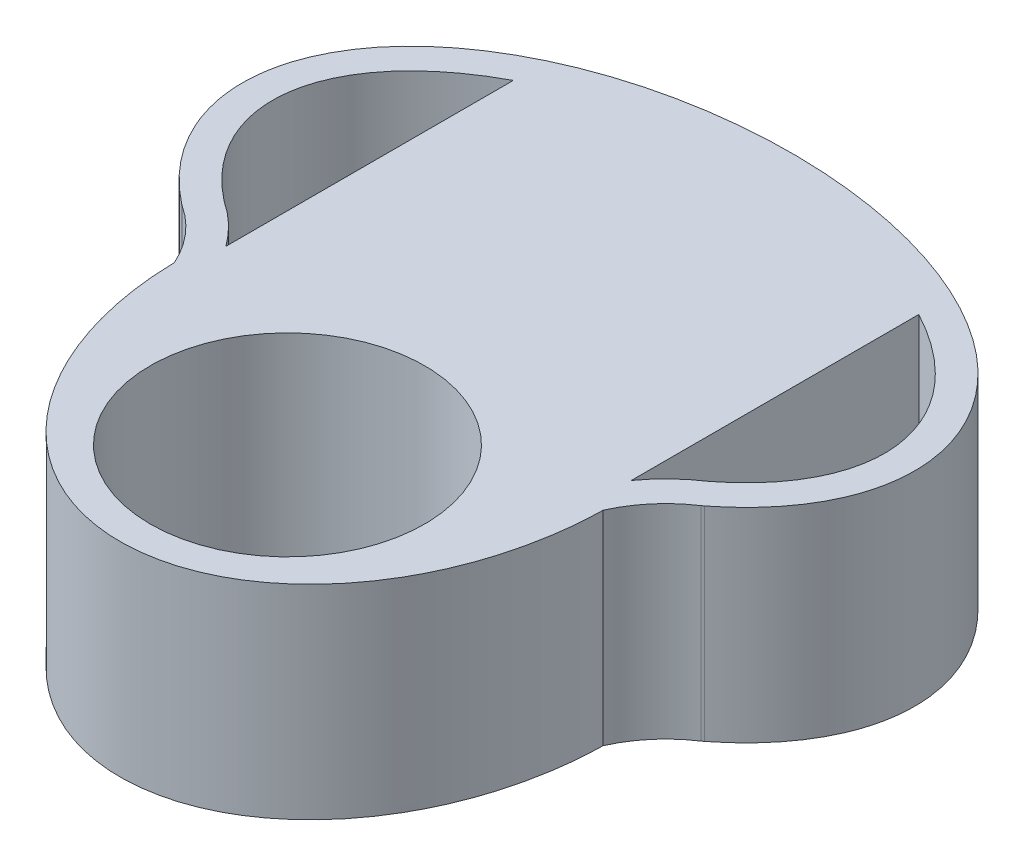
ISO-10303-21;
HEADER;
FILE_DESCRIPTION(('STEP AP214'),'2;1');
FILE_NAME('part.step','',(''),(''),'','','');
FILE_SCHEMA(('AUTOMOTIVE_DESIGN { 1 0 10303 214 1 1 1 1 }'));
ENDSEC;
DATA;
#1=APPLICATION_CONTEXT('core data for automotive mechanical design processes');
#2=APPLICATION_PROTOCOL_DEFINITION('international standard','automotive_design',2000,#1);
#3=PRODUCT_CONTEXT('',#1,'mechanical');
#4=PRODUCT('Part','Part','',(#3));
#5=PRODUCT_RELATED_PRODUCT_CATEGORY('part','',(#4));
#6=PRODUCT_DEFINITION_FORMATION('','',#4);
#7=PRODUCT_DEFINITION_CONTEXT('part definition',#1,'design');
#8=PRODUCT_DEFINITION('design','',#6,#7);
#9=PRODUCT_DEFINITION_SHAPE('','',#8);
#10=(LENGTH_UNIT() NAMED_UNIT(*) SI_UNIT(.MILLI.,.METRE.));
#11=(NAMED_UNIT(*) PLANE_ANGLE_UNIT() SI_UNIT($,.RADIAN.));
#12=(NAMED_UNIT(*) SI_UNIT($,.STERADIAN.) SOLID_ANGLE_UNIT());
#13=UNCERTAINTY_MEASURE_WITH_UNIT(LENGTH_MEASURE(1.E-05),#10,'distance_accuracy_value','');
#14=(GEOMETRIC_REPRESENTATION_CONTEXT(3) GLOBAL_UNCERTAINTY_ASSIGNED_CONTEXT((#13)) GLOBAL_UNIT_ASSIGNED_CONTEXT((#10,
#11,#12)) REPRESENTATION_CONTEXT('',''));
#15=CARTESIAN_POINT('',(0.,0.,0.));
#16=DIRECTION('',(0.,0.,1.));
#17=DIRECTION('',(1.,0.,0.));
#18=AXIS2_PLACEMENT_3D('',#15,#16,#17);
#19=CARTESIAN_POINT('',(-81.4182714062224,63.5,42.1452711751867));
#20=CARTESIAN_POINT('',(-82.1708929781573,63.5,41.5556056887247));
#21=CARTESIAN_POINT('',(-83.6619475125654,63.5,40.344682659538));
#22=CARTESIAN_POINT('',(-86.5049171261992,63.5,37.858902663532));
#23=CARTESIAN_POINT('',(-89.8261064509955,63.5,34.6056144611416));
#24=CARTESIAN_POINT('',(-93.4024484768764,63.5,30.4841299490515));
#25=CARTESIAN_POINT('',(-97.5926099560615,63.5,24.7087254973296));
#26=CARTESIAN_POINT('',(-101.670899734114,63.5,16.9947837439685));
#27=CARTESIAN_POINT('',(-104.458923137578,63.5,7.12114955794227));
#28=CARTESIAN_POINT('',(-104.93539808692,63.5,-3.04481984295246));
#29=CARTESIAN_POINT('',(-102.433523024151,63.5,-16.4361873171428));
#30=CARTESIAN_POINT('',(-93.8030884577416,63.5,-31.8529588916091));
#31=CARTESIAN_POINT('',(-76.6112472127849,63.5,-46.8727046124652));
#32=CARTESIAN_POINT('',(-54.1788674721127,63.5,-58.0537064339531));
#33=CARTESIAN_POINT('',(-28.0503761909839,63.5,-64.9811066700789));
#34=CARTESIAN_POINT('',(0.,63.5,-67.3314466649606));
#35=CARTESIAN_POINT('',(28.0503761909839,63.5,-64.9811066700788));
#36=CARTESIAN_POINT('',(54.1788674721128,63.5,-58.0537064339531));
#37=CARTESIAN_POINT('',(76.6112472127849,63.5,-46.8727046124652));
#38=CARTESIAN_POINT('',(93.8030884577416,63.5,-31.8529588916091));
#39=CARTESIAN_POINT('',(102.433523024151,63.5,-16.4361873171428));
#40=CARTESIAN_POINT('',(104.93539808692,63.5,-3.04481984295245));
#41=CARTESIAN_POINT('',(104.458923137578,63.5,7.12114955794228));
#42=CARTESIAN_POINT('',(101.670899734114,63.5,16.9947837439686));
#43=CARTESIAN_POINT('',(97.5926099560615,63.5,24.7087254973296));
#44=CARTESIAN_POINT('',(93.4024484768764,63.5,30.4841299490515));
#45=CARTESIAN_POINT('',(89.8261064509955,63.5,34.6056144611416));
#46=CARTESIAN_POINT('',(86.5049171261991,63.5,37.8589026635321));
#47=CARTESIAN_POINT('',(83.6619475125654,63.5,40.344682659538));
#48=CARTESIAN_POINT('',(82.1708929781573,63.5,41.5556056887247));
#49=CARTESIAN_POINT('',(81.4182714062224,63.5,42.1452711751867));
#50=B_SPLINE_CURVE_WITH_KNOTS('',3,(#19,#20,#21,#22,#23,#24,#25,#26,#27,#28,#29,#30,#31,#32,#33,
#34,#35,#36,#37,#38,#39,#40,#41,#42,#43,#44,#45,#46,#47,#48,#49),.UNSPECIFIED.,.F.,.F.,(4,1,1,1,
1,1,1,1,1,1,1,1,1,1,1,1,1,1,1,1,1,1,1,1,1,1,1,1,4),(-0.653544263959844,-0.618788942229301,
-0.584033620498758,-0.514522977037672,-0.445012333576587,-0.375501690115501,-0.23648040319333,
-0.0974591162711587,0.0415621706510123,0.180583457573184,0.458626031417526,0.736668605261869,
1.01471117910621,1.29275375295055,1.5707963267949,1.84883890063924,2.12688147448358,
2.40492404832792,2.68296662217227,2.96100919601661,3.10003048293878,3.23905176986095,
3.37807305678312,3.51709434370529,3.58660498716638,3.65611563062747,3.72562627408855,
3.76038159581909,3.79513691754964),.UNSPECIFIED.);
#51=DIRECTION('',(0.,-1.,0.));
#52=VECTOR('',#51,1.);
#53=SURFACE_OF_LINEAR_EXTRUSION('',#50,#52);
#54=CARTESIAN_POINT('',(-81.4182714062224,0.,42.1452711751867));
#55=CARTESIAN_POINT('',(-82.1708929781573,0.,41.5556056887247));
#56=CARTESIAN_POINT('',(-83.6619475125654,0.,40.344682659538));
#57=CARTESIAN_POINT('',(-86.5049171261992,0.,37.858902663532));
#58=CARTESIAN_POINT('',(-89.8261064509955,0.,34.6056144611416));
#59=CARTESIAN_POINT('',(-93.4024484768764,0.,30.4841299490515));
#60=CARTESIAN_POINT('',(-97.5926099560615,0.,24.7087254973296));
#61=CARTESIAN_POINT('',(-101.670899734114,0.,16.9947837439685));
#62=CARTESIAN_POINT('',(-104.458923137578,0.,7.12114955794227));
#63=CARTESIAN_POINT('',(-104.93539808692,0.,-3.04481984295246));
#64=CARTESIAN_POINT('',(-102.433523024151,0.,-16.4361873171428));
#65=CARTESIAN_POINT('',(-93.8030884577416,0.,-31.8529588916091));
#66=CARTESIAN_POINT('',(-76.6112472127849,0.,-46.8727046124652));
#67=CARTESIAN_POINT('',(-54.1788674721127,0.,-58.0537064339531));
#68=CARTESIAN_POINT('',(-28.0503761909839,0.,-64.9811066700789));
#69=CARTESIAN_POINT('',(0.,0.,-67.3314466649606));
#70=CARTESIAN_POINT('',(28.0503761909839,0.,-64.9811066700788));
#71=CARTESIAN_POINT('',(54.1788674721128,0.,-58.0537064339531));
#72=CARTESIAN_POINT('',(76.6112472127849,0.,-46.8727046124652));
#73=CARTESIAN_POINT('',(93.8030884577416,0.,-31.8529588916091));
#74=CARTESIAN_POINT('',(102.433523024151,0.,-16.4361873171428));
#75=CARTESIAN_POINT('',(104.93539808692,0.,-3.04481984295245));
#76=CARTESIAN_POINT('',(104.458923137578,0.,7.12114955794228));
#77=CARTESIAN_POINT('',(101.670899734114,0.,16.9947837439686));
#78=CARTESIAN_POINT('',(97.5926099560615,0.,24.7087254973296));
#79=CARTESIAN_POINT('',(93.4024484768764,0.,30.4841299490515));
#80=CARTESIAN_POINT('',(89.8261064509955,0.,34.6056144611416));
#81=CARTESIAN_POINT('',(86.5049171261991,0.,37.8589026635321));
#82=CARTESIAN_POINT('',(83.6619475125654,0.,40.344682659538));
#83=CARTESIAN_POINT('',(82.1708929781573,0.,41.5556056887247));
#84=CARTESIAN_POINT('',(81.4182714062224,0.,42.1452711751867));
#85=B_SPLINE_CURVE_WITH_KNOTS('',3,(#54,#55,#56,#57,#58,#59,#60,#61,#62,#63,#64,#65,#66,#67,#68,
#69,#70,#71,#72,#73,#74,#75,#76,#77,#78,#79,#80,#81,#82,#83,#84),.UNSPECIFIED.,.F.,.F.,(4,1,1,1,
1,1,1,1,1,1,1,1,1,1,1,1,1,1,1,1,1,1,1,1,1,1,1,1,4),(-0.653544263959844,-0.618788942229301,
-0.584033620498758,-0.514522977037672,-0.445012333576587,-0.375501690115501,-0.23648040319333,
-0.0974591162711587,0.0415621706510123,0.180583457573184,0.458626031417526,0.736668605261869,
1.01471117910621,1.29275375295055,1.5707963267949,1.84883890063924,2.12688147448358,
2.40492404832792,2.68296662217227,2.96100919601661,3.10003048293878,3.23905176986095,
3.37807305678312,3.51709434370529,3.58660498716638,3.65611563062747,3.72562627408855,
3.76038159581909,3.79513691754964),.UNSPECIFIED.);
#86=CARTESIAN_POINT('',(-81.4182714062224,0.,42.1452711751867));
#87=VERTEX_POINT('',#86);
#88=CARTESIAN_POINT('',(81.4182714062224,0.,42.1452711751867));
#89=VERTEX_POINT('',#88);
#90=EDGE_CURVE('E232',#87,#89,#85,.T.);
#91=ORIENTED_EDGE('',*,*,#90,.F.);
#92=DIRECTION('',(0.,-1.,0.));
#93=VECTOR('',#92,1.);
#94=CARTESIAN_POINT('',(-81.4182714062224,63.5,42.1452711751867));
#95=LINE('',#94,#93);
#96=CARTESIAN_POINT('',(-81.4182714062224,63.5,42.1452711751867));
#97=VERTEX_POINT('',#96);
#98=EDGE_CURVE('E11',#97,#87,#95,.T.);
#99=ORIENTED_EDGE('',*,*,#98,.F.);
#100=CARTESIAN_POINT('',(81.4182714062224,63.5,42.1452711751867));
#101=VERTEX_POINT('',#100);
#102=EDGE_CURVE('E309',#97,#101,#50,.T.);
#103=ORIENTED_EDGE('',*,*,#102,.T.);
#104=DIRECTION('',(0.,-1.,0.));
#105=VECTOR('',#104,1.);
#106=CARTESIAN_POINT('',(81.4182714062224,63.5,42.1452711751867));
#107=LINE('',#106,#105);
#108=EDGE_CURVE('E67',#101,#89,#107,.T.);
#109=ORIENTED_EDGE('',*,*,#108,.T.);
#110=EDGE_LOOP('',(#91,#99,#103,#109));
#111=FACE_BOUND('',#110,.T.);
#112=ADVANCED_FACE('F47',(#111),#53,.T.);
#113=CARTESIAN_POINT('',(-47.6827125048098,63.5,66.3789146986905));
#114=DIRECTION('',(0.583417132121285,0.,-0.812172672494818));
#115=DIRECTION('',(-0.812172672494818,0.,-0.583417132121285));
#116=AXIS2_PLACEMENT_3D('',#113,#114,#115);
#117=PLANE('',#116);
#118=DIRECTION('',(0.812172672494818,0.,0.583417132121285));
#119=VECTOR('',#118,1.);
#120=CARTESIAN_POINT('',(-47.6827125048098,0.,66.3789146986905));
#121=LINE('',#120,#119);
#122=CARTESIAN_POINT('',(-80.7825242383083,0.,42.6019545899577));
#123=VERTEX_POINT('',#122);
#124=EDGE_CURVE('E237',#87,#123,#121,.T.);
#125=ORIENTED_EDGE('',*,*,#124,.T.);
#126=DIRECTION('',(0.,-1.,0.));
#127=VECTOR('',#126,1.);
#128=CARTESIAN_POINT('',(-80.7825242383083,63.5,42.6019545899577));
#129=LINE('',#128,#127);
#130=CARTESIAN_POINT('',(-80.7825242383083,63.5,42.6019545899577));
#131=VERTEX_POINT('',#130);
#132=EDGE_CURVE('E58',#131,#123,#129,.T.);
#133=ORIENTED_EDGE('',*,*,#132,.F.);
#134=DIRECTION('',(0.812172672494818,0.,0.583417132121285));
#135=VECTOR('',#134,1.);
#136=CARTESIAN_POINT('',(-47.6827125048098,63.5,66.3789146986905));
#137=LINE('',#136,#135);
#138=EDGE_CURVE('E316',#97,#131,#137,.T.);
#139=ORIENTED_EDGE('',*,*,#138,.F.);
#140=ORIENTED_EDGE('',*,*,#98,.T.);
#141=EDGE_LOOP('',(#125,#133,#139,#140));
#142=FACE_BOUND('',#141,.T.);
#143=ADVANCED_FACE('F300',(#142),#117,.F.);
#144=CARTESIAN_POINT('',(-101.94657990215,63.5,74.8157213419758));
#145=DIRECTION('',(0.,-1.,0.));
#146=DIRECTION('',(0.,0.,-1.));
#147=AXIS2_PLACEMENT_3D('',#144,#145,#146);
#148=CYLINDRICAL_SURFACE('',#147,38.5440529848069);
#149=CARTESIAN_POINT('',(-101.94657990215,0.,74.8157213419758));
#150=DIRECTION('',(0.,1.,0.));
#151=DIRECTION('',(0.,0.,1.));
#152=AXIS2_PLACEMENT_3D('',#149,#150,#151);
#153=CIRCLE('',#152,38.5440529848069);
#154=CARTESIAN_POINT('',(-66.7590344228129,0.,59.084203181442));
#155=VERTEX_POINT('',#154);
#156=EDGE_CURVE('E244',#155,#123,#153,.T.);
#157=ORIENTED_EDGE('',*,*,#156,.F.);
#158=DIRECTION('',(0.,-1.,0.));
#159=VECTOR('',#158,1.);
#160=CARTESIAN_POINT('',(-66.7590344228129,63.5,59.084203181442));
#161=LINE('',#160,#159);
#162=CARTESIAN_POINT('',(-66.7590344228129,63.5,59.084203181442));
#163=VERTEX_POINT('',#162);
#164=EDGE_CURVE('E169',#163,#155,#161,.T.);
#165=ORIENTED_EDGE('',*,*,#164,.F.);
#166=CARTESIAN_POINT('',(-101.94657990215,63.5,74.8157213419758));
#167=DIRECTION('',(0.,1.,0.));
#168=DIRECTION('',(0.,0.,1.));
#169=AXIS2_PLACEMENT_3D('',#166,#167,#168);
#170=CIRCLE('',#169,38.5440529848069);
#171=EDGE_CURVE('E161',#163,#131,#170,.T.);
#172=ORIENTED_EDGE('',*,*,#171,.T.);
#173=ORIENTED_EDGE('',*,*,#132,.T.);
#174=EDGE_LOOP('',(#157,#165,#172,#173));
#175=FACE_BOUND('',#174,.T.);
#176=ADVANCED_FACE('F304',(#175),#148,.F.);
#177=CARTESIAN_POINT('',(-66.7759504205773,63.5,57.15));
#178=CARTESIAN_POINT('',(-66.7759504205773,63.5,57.632150270503));
#179=CARTESIAN_POINT('',(-66.7706630287052,63.5,58.4397625670723));
#180=CARTESIAN_POINT('',(-66.6753452860118,63.5,63.887652611526));
#181=CARTESIAN_POINT('',(-65.7907136205258,63.5,74.2866698711106));
#182=CARTESIAN_POINT('',(-62.3656978160761,63.5,89.2909621443138));
#183=CARTESIAN_POINT('',(-56.4612168861994,63.5,103.979945176019));
#184=CARTESIAN_POINT('',(-45.7252585032076,63.5,121.392835834652));
#185=CARTESIAN_POINT('',(-31.0376492583143,63.5,134.546769236864));
#186=CARTESIAN_POINT('',(-13.714508461377,63.5,141.546891793129));
#187=CARTESIAN_POINT('',(0.,63.5,143.348554103435));
#188=CARTESIAN_POINT('',(13.714508461377,63.5,141.546891793129));
#189=CARTESIAN_POINT('',(31.0376492583143,63.5,134.546769236864));
#190=CARTESIAN_POINT('',(45.7252585032076,63.5,121.392835834652));
#191=CARTESIAN_POINT('',(56.4612168861994,63.5,103.979945176019));
#192=CARTESIAN_POINT('',(62.3656978160761,63.5,89.2909621443138));
#193=CARTESIAN_POINT('',(65.7907136205258,63.5,74.2866698711106));
#194=CARTESIAN_POINT('',(66.6753452860118,63.5,63.887652611526));
#195=CARTESIAN_POINT('',(66.7706630287052,63.5,58.4397625670723));
#196=CARTESIAN_POINT('',(66.7759504205773,63.5,57.632150270503));
#197=CARTESIAN_POINT('',(66.7759504205773,63.5,57.15));
#198=B_SPLINE_CURVE_WITH_KNOTS('',3,(#177,#178,#179,#180,#181,#182,#183,#184,#185,#186,#187,
#188,#189,#190,#191,#192,#193,#194,#195,#196,#197),.UNSPECIFIED.,.F.,.F.,(4,1,1,1,1,1,1,1,1,1,1,
1,1,1,1,1,1,1,4),(-1.5707963267949,-1.55337524812177,-1.54176119567302,-1.37444678594553,
-1.17809724509617,-0.981747704246811,-0.785398163397448,-0.392699081698724,-0.196349540849362,
0.,0.196349540849362,0.392699081698724,0.785398163397448,0.981747704246811,1.17809724509617,
1.37444678594553,1.54176119567302,1.55337524812177,1.5707963267949),.UNSPECIFIED.);
#199=DIRECTION('',(0.,-1.,0.));
#200=VECTOR('',#199,1.);
#201=SURFACE_OF_LINEAR_EXTRUSION('',#198,#200);
#202=CARTESIAN_POINT('',(-66.7759504205773,0.,57.15));
#203=CARTESIAN_POINT('',(-66.7759504205773,0.,57.632150270503));
#204=CARTESIAN_POINT('',(-66.7706630287052,0.,58.4397625670723));
#205=CARTESIAN_POINT('',(-66.6753452860118,0.,63.887652611526));
#206=CARTESIAN_POINT('',(-65.7907136205258,0.,74.2866698711106));
#207=CARTESIAN_POINT('',(-62.3656978160761,0.,89.2909621443138));
#208=CARTESIAN_POINT('',(-56.4612168861994,0.,103.979945176019));
#209=CARTESIAN_POINT('',(-45.7252585032076,0.,121.392835834652));
#210=CARTESIAN_POINT('',(-31.0376492583143,0.,134.546769236864));
#211=CARTESIAN_POINT('',(-13.714508461377,0.,141.546891793129));
#212=CARTESIAN_POINT('',(0.,0.,143.348554103435));
#213=CARTESIAN_POINT('',(13.714508461377,0.,141.546891793129));
#214=CARTESIAN_POINT('',(31.0376492583143,0.,134.546769236864));
#215=CARTESIAN_POINT('',(45.7252585032076,0.,121.392835834652));
#216=CARTESIAN_POINT('',(56.4612168861994,0.,103.979945176019));
#217=CARTESIAN_POINT('',(62.3656978160761,0.,89.2909621443138));
#218=CARTESIAN_POINT('',(65.7907136205258,0.,74.2866698711106));
#219=CARTESIAN_POINT('',(66.6753452860118,0.,63.887652611526));
#220=CARTESIAN_POINT('',(66.7706630287052,0.,58.4397625670723));
#221=CARTESIAN_POINT('',(66.7759504205773,0.,57.632150270503));
#222=CARTESIAN_POINT('',(66.7759504205773,0.,57.15));
#223=B_SPLINE_CURVE_WITH_KNOTS('',3,(#202,#203,#204,#205,#206,#207,#208,#209,#210,#211,#212,
#213,#214,#215,#216,#217,#218,#219,#220,#221,#222),.UNSPECIFIED.,.F.,.F.,(4,1,1,1,1,1,1,1,1,1,1,
1,1,1,1,1,1,1,4),(-1.5707963267949,-1.55337524812177,-1.54176119567302,-1.37444678594553,
-1.17809724509617,-0.981747704246811,-0.785398163397448,-0.392699081698724,-0.196349540849362,
0.,0.196349540849362,0.392699081698724,0.785398163397448,0.981747704246811,1.17809724509617,
1.37444678594553,1.54176119567302,1.55337524812177,1.5707963267949),.UNSPECIFIED.);
#224=CARTESIAN_POINT('',(66.7590344228129,0.,59.084203181442));
#225=VERTEX_POINT('',#224);
#226=EDGE_CURVE('E167',#155,#225,#223,.T.);
#227=ORIENTED_EDGE('',*,*,#226,.T.);
#228=DIRECTION('',(0.,-1.,0.));
#229=VECTOR('',#228,1.);
#230=CARTESIAN_POINT('',(66.7590344228129,63.5,59.084203181442));
#231=LINE('',#230,#229);
#232=CARTESIAN_POINT('',(66.7590344228129,63.5,59.084203181442));
#233=VERTEX_POINT('',#232);
#234=EDGE_CURVE('E148',#233,#225,#231,.T.);
#235=ORIENTED_EDGE('',*,*,#234,.F.);
#236=EDGE_CURVE('E154',#163,#233,#198,.T.);
#237=ORIENTED_EDGE('',*,*,#236,.F.);
#238=ORIENTED_EDGE('',*,*,#164,.T.);
#239=EDGE_LOOP('',(#227,#235,#237,#238));
#240=FACE_BOUND('',#239,.T.);
#241=ADVANCED_FACE('F165',(#240),#201,.F.);
#242=CARTESIAN_POINT('',(101.94657990215,63.5,74.8157213419758));
#243=DIRECTION('',(0.,-1.,0.));
#244=DIRECTION('',(0.,0.,-1.));
#245=AXIS2_PLACEMENT_3D('',#242,#243,#244);
#246=CYLINDRICAL_SURFACE('',#245,38.5440529848069);
#247=CARTESIAN_POINT('',(101.94657990215,0.,74.8157213419758));
#248=DIRECTION('',(0.,1.,0.));
#249=DIRECTION('',(0.,0.,1.));
#250=AXIS2_PLACEMENT_3D('',#247,#248,#249);
#251=CIRCLE('',#250,38.5440529848069);
#252=CARTESIAN_POINT('',(80.7825242383083,0.,42.6019545899577));
#253=VERTEX_POINT('',#252);
#254=EDGE_CURVE('E252',#225,#253,#251,.F.);
#255=ORIENTED_EDGE('',*,*,#254,.T.);
#256=DIRECTION('',(0.,-1.,0.));
#257=VECTOR('',#256,1.);
#258=CARTESIAN_POINT('',(80.7825242383083,63.5,42.6019545899577));
#259=LINE('',#258,#257);
#260=CARTESIAN_POINT('',(80.7825242383083,63.5,42.6019545899577));
#261=VERTEX_POINT('',#260);
#262=EDGE_CURVE('E105',#261,#253,#259,.T.);
#263=ORIENTED_EDGE('',*,*,#262,.F.);
#264=CARTESIAN_POINT('',(101.94657990215,63.5,74.8157213419758));
#265=DIRECTION('',(0.,1.,0.));
#266=DIRECTION('',(0.,0.,1.));
#267=AXIS2_PLACEMENT_3D('',#264,#265,#266);
#268=CIRCLE('',#267,38.5440529848069);
#269=EDGE_CURVE('E144',#233,#261,#268,.F.);
#270=ORIENTED_EDGE('',*,*,#269,.F.);
#271=ORIENTED_EDGE('',*,*,#234,.T.);
#272=EDGE_LOOP('',(#255,#263,#270,#271));
#273=FACE_BOUND('',#272,.T.);
#274=ADVANCED_FACE('F146',(#273),#246,.F.);
#275=CARTESIAN_POINT('',(-63.1171512630198,63.5,0.));
#276=DIRECTION('',(-1.,0.,0.));
#277=DIRECTION('',(0.,0.,1.));
#278=AXIS2_PLACEMENT_3D('',#275,#276,#277);
#279=PLANE('',#278);
#280=DIRECTION('',(0.,0.,-1.));
#281=VECTOR('',#280,1.);
#282=CARTESIAN_POINT('',(-63.1171512630198,0.,0.));
#283=LINE('',#282,#281);
#284=CARTESIAN_POINT('',(-63.1171512630198,0.,46.696050007539));
#285=VERTEX_POINT('',#284);
#286=CARTESIAN_POINT('',(-63.1171512630198,0.,-42.8014436429286));
#287=VERTEX_POINT('',#286);
#288=EDGE_CURVE('E219',#285,#287,#283,.T.);
#289=ORIENTED_EDGE('',*,*,#288,.F.);
#290=DIRECTION('',(0.,-1.,0.));
#291=VECTOR('',#290,1.);
#292=CARTESIAN_POINT('',(-63.1171512630198,63.5,46.696050007539));
#293=LINE('',#292,#291);
#294=CARTESIAN_POINT('',(-63.1171512630198,63.5,46.696050007539));
#295=VERTEX_POINT('',#294);
#296=EDGE_CURVE('E185',#295,#285,#293,.T.);
#297=ORIENTED_EDGE('',*,*,#296,.F.);
#298=DIRECTION('',(0.,0.,-1.));
#299=VECTOR('',#298,1.);
#300=CARTESIAN_POINT('',(-63.1171512630198,63.5,0.));
#301=LINE('',#300,#299);
#302=CARTESIAN_POINT('',(-63.1171512630198,63.5,-42.8014436429286));
#303=VERTEX_POINT('',#302);
#304=EDGE_CURVE('E274',#295,#303,#301,.T.);
#305=ORIENTED_EDGE('',*,*,#304,.T.);
#306=DIRECTION('',(0.,-1.,0.));
#307=VECTOR('',#306,1.);
#308=CARTESIAN_POINT('',(-63.1171512630198,63.5,-42.8014436429286));
#309=LINE('',#308,#307);
#310=EDGE_CURVE('E179',#303,#287,#309,.T.);
#311=ORIENTED_EDGE('',*,*,#310,.T.);
#312=EDGE_LOOP('',(#289,#297,#305,#311));
#313=FACE_BOUND('',#312,.T.);
#314=ADVANCED_FACE('F289',(#313),#279,.T.);
#315=CARTESIAN_POINT('',(-101.94657990215,63.5,74.8157213419758));
#316=DIRECTION('',(0.,-1.,0.));
#317=DIRECTION('',(0.,0.,-1.));
#318=AXIS2_PLACEMENT_3D('',#315,#316,#317);
#319=CYLINDRICAL_SURFACE('',#318,47.9420529848069);
#320=CARTESIAN_POINT('',(-101.94657990215,0.,74.8157213419758));
#321=DIRECTION('',(0.,1.,0.));
#322=DIRECTION('',(0.,0.,1.));
#323=AXIS2_PLACEMENT_3D('',#320,#321,#322);
#324=CIRCLE('',#323,47.9420529848069);
#325=CARTESIAN_POINT('',(-75.6222004081397,0.,34.7474360198738));
#326=VERTEX_POINT('',#325);
#327=EDGE_CURVE('E224',#285,#326,#324,.T.);
#328=ORIENTED_EDGE('',*,*,#327,.T.);
#329=DIRECTION('',(0.,-1.,0.));
#330=VECTOR('',#329,1.);
#331=CARTESIAN_POINT('',(-75.6222004081397,63.5,34.7474360198738));
#332=LINE('',#331,#330);
#333=CARTESIAN_POINT('',(-75.6222004081397,63.5,34.7474360198738));
#334=VERTEX_POINT('',#333);
#335=EDGE_CURVE('E182',#334,#326,#332,.T.);
#336=ORIENTED_EDGE('',*,*,#335,.F.);
#337=CARTESIAN_POINT('',(-101.94657990215,63.5,74.8157213419758));
#338=DIRECTION('',(0.,1.,0.));
#339=DIRECTION('',(0.,0.,1.));
#340=AXIS2_PLACEMENT_3D('',#337,#338,#339);
#341=CIRCLE('',#340,47.9420529848069);
#342=EDGE_CURVE('E348',#295,#334,#341,.T.);
#343=ORIENTED_EDGE('',*,*,#342,.F.);
#344=ORIENTED_EDGE('',*,*,#296,.T.);
#345=EDGE_LOOP('',(#328,#336,#343,#344));
#346=FACE_BOUND('',#345,.T.);
#347=ADVANCED_FACE('F286',(#346),#319,.T.);
#348=CARTESIAN_POINT('',(101.94657990215,63.5,74.8157213419758));
#349=DIRECTION('',(0.,-1.,0.));
#350=DIRECTION('',(0.,0.,-1.));
#351=AXIS2_PLACEMENT_3D('',#348,#349,#350);
#352=CYLINDRICAL_SURFACE('',#351,47.9420529848069);
#353=CARTESIAN_POINT('',(101.94657990215,0.,74.8157213419758));
#354=DIRECTION('',(0.,1.,0.));
#355=DIRECTION('',(0.,0.,1.));
#356=AXIS2_PLACEMENT_3D('',#353,#354,#355);
#357=CIRCLE('',#356,47.9420529848069);
#358=CARTESIAN_POINT('',(63.1171512630198,0.,46.696050007539));
#359=VERTEX_POINT('',#358);
#360=CARTESIAN_POINT('',(75.6222004081397,0.,34.7474360198738));
#361=VERTEX_POINT('',#360);
#362=EDGE_CURVE('E209',#359,#361,#357,.F.);
#363=ORIENTED_EDGE('',*,*,#362,.F.);
#364=DIRECTION('',(0.,-1.,0.));
#365=VECTOR('',#364,1.);
#366=CARTESIAN_POINT('',(63.1171512630198,63.5,46.696050007539));
#367=LINE('',#366,#365);
#368=CARTESIAN_POINT('',(63.1171512630198,63.5,46.696050007539));
#369=VERTEX_POINT('',#368);
#370=EDGE_CURVE('E51',#369,#359,#367,.T.);
#371=ORIENTED_EDGE('',*,*,#370,.F.);
#372=CARTESIAN_POINT('',(101.94657990215,63.5,74.8157213419758));
#373=DIRECTION('',(0.,1.,0.));
#374=DIRECTION('',(0.,0.,1.));
#375=AXIS2_PLACEMENT_3D('',#372,#373,#374);
#376=CIRCLE('',#375,47.9420529848069);
#377=CARTESIAN_POINT('',(75.6222004081397,63.5,34.7474360198738));
#378=VERTEX_POINT('',#377);
#379=EDGE_CURVE('E261',#369,#378,#376,.F.);
#380=ORIENTED_EDGE('',*,*,#379,.T.);
#381=DIRECTION('',(0.,-1.,0.));
#382=VECTOR('',#381,1.);
#383=CARTESIAN_POINT('',(75.6222004081397,63.5,34.7474360198738));
#384=LINE('',#383,#382);
#385=EDGE_CURVE('E188',#378,#361,#384,.T.);
#386=ORIENTED_EDGE('',*,*,#385,.T.);
#387=EDGE_LOOP('',(#363,#371,#380,#386));
#388=FACE_BOUND('',#387,.T.);
#389=ADVANCED_FACE('F49',(#388),#352,.T.);
#390=CARTESIAN_POINT('',(63.1171512630198,63.5,0.));
#391=DIRECTION('',(-1.,0.,0.));
#392=DIRECTION('',(0.,0.,1.));
#393=AXIS2_PLACEMENT_3D('',#390,#391,#392);
#394=PLANE('',#393);
#395=DIRECTION('',(0.,0.,-1.));
#396=VECTOR('',#395,1.);
#397=CARTESIAN_POINT('',(63.1171512630198,0.,0.));
#398=LINE('',#397,#396);
#399=CARTESIAN_POINT('',(63.1171512630198,0.,-42.8014436429286));
#400=VERTEX_POINT('',#399);
#401=EDGE_CURVE('E201',#359,#400,#398,.T.);
#402=ORIENTED_EDGE('',*,*,#401,.T.);
#403=DIRECTION('',(0.,-1.,0.));
#404=VECTOR('',#403,1.);
#405=CARTESIAN_POINT('',(63.1171512630198,63.5,-42.8014436429286));
#406=LINE('',#405,#404);
#407=CARTESIAN_POINT('',(63.1171512630198,63.5,-42.8014436429286));
#408=VERTEX_POINT('',#407);
#409=EDGE_CURVE('E190',#408,#400,#406,.T.);
#410=ORIENTED_EDGE('',*,*,#409,.F.);
#411=DIRECTION('',(0.,0.,-1.));
#412=VECTOR('',#411,1.);
#413=CARTESIAN_POINT('',(63.1171512630198,63.5,0.));
#414=LINE('',#413,#412);
#415=EDGE_CURVE('E203',#369,#408,#414,.T.);
#416=ORIENTED_EDGE('',*,*,#415,.F.);
#417=ORIENTED_EDGE('',*,*,#370,.T.);
#418=EDGE_LOOP('',(#402,#410,#416,#417));
#419=FACE_BOUND('',#418,.T.);
#420=ADVANCED_FACE('F200',(#419),#394,.F.);
#421=CARTESIAN_POINT('',(0.,63.5,90.6305373706325));
#422=DIRECTION('',(0.,-1.,0.));
#423=DIRECTION('',(0.,0.,-1.));
#424=AXIS2_PLACEMENT_3D('',#421,#422,#423);
#425=CYLINDRICAL_SURFACE('',#424,42.7194626293674);
#426=CARTESIAN_POINT('',(0.,63.5,90.6305373706325));
#427=DIRECTION('',(0.,1.,0.));
#428=DIRECTION('',(0.,0.,1.));
#429=AXIS2_PLACEMENT_3D('',#426,#427,#428);
#430=CIRCLE('',#429,42.7194626293674);
#431=CARTESIAN_POINT('',(0.,63.5,133.35));
#432=VERTEX_POINT('',#431);
#433=EDGE_CURVE('E317',#432,#432,#430,.T.);
#434=ORIENTED_EDGE('',*,*,#433,.T.);
#435=EDGE_LOOP('',(#434));
#436=FACE_BOUND('',#435,.T.);
#437=CARTESIAN_POINT('',(0.,0.,90.6305373706325));
#438=DIRECTION('',(0.,1.,0.));
#439=DIRECTION('',(0.,0.,1.));
#440=AXIS2_PLACEMENT_3D('',#437,#438,#439);
#441=CIRCLE('',#440,42.7194626293674);
#442=CARTESIAN_POINT('',(0.,0.,133.35));
#443=VERTEX_POINT('',#442);
#444=EDGE_CURVE('E228',#443,#443,#441,.T.);
#445=ORIENTED_EDGE('',*,*,#444,.F.);
#446=EDGE_LOOP('',(#445));
#447=FACE_BOUND('',#446,.T.);
#448=ADVANCED_FACE('F283',(#436,#447),#425,.F.);
#449=CARTESIAN_POINT('',(0.,63.5,0.));
#450=DIRECTION('',(0.,1.,0.));
#451=DIRECTION('',(-1.,0.,0.));
#452=AXIS2_PLACEMENT_3D('',#449,#450,#451);
#453=ELLIPSE('',#452,95.25,57.15);
#454=DIRECTION('',(0.,-1.,0.));
#455=VECTOR('',#454,1.);
#456=SURFACE_OF_LINEAR_EXTRUSION('',#453,#455);
#457=CARTESIAN_POINT('',(0.,0.,0.));
#458=DIRECTION('',(0.,1.,0.));
#459=DIRECTION('',(-1.,0.,0.));
#460=AXIS2_PLACEMENT_3D('',#457,#458,#459);
#461=ELLIPSE('',#460,95.25,57.15);
#462=EDGE_CURVE('E220',#287,#326,#461,.T.);
#463=ORIENTED_EDGE('',*,*,#462,.F.);
#464=ORIENTED_EDGE('',*,*,#310,.F.);
#465=EDGE_CURVE('E275',#303,#334,#453,.T.);
#466=ORIENTED_EDGE('',*,*,#465,.T.);
#467=ORIENTED_EDGE('',*,*,#335,.T.);
#468=EDGE_LOOP('',(#463,#464,#466,#467));
#469=FACE_BOUND('',#468,.T.);
#470=ADVANCED_FACE('F278',(#469),#456,.T.);
#471=EDGE_CURVE('E210',#361,#400,#461,.T.);
#472=ORIENTED_EDGE('',*,*,#471,.F.);
#473=ORIENTED_EDGE('',*,*,#385,.F.);
#474=EDGE_CURVE('E268',#378,#408,#453,.T.);
#475=ORIENTED_EDGE('',*,*,#474,.T.);
#476=ORIENTED_EDGE('',*,*,#409,.T.);
#477=EDGE_LOOP('',(#472,#473,#475,#476));
#478=FACE_BOUND('',#477,.T.);
#479=ADVANCED_FACE('F282',(#478),#456,.T.);
#480=CARTESIAN_POINT('',(47.68271250481,63.5,66.3789146986905));
#481=DIRECTION('',(0.583417132121288,0.,0.812172672494816));
#482=DIRECTION('',(0.812172672494816,0.,-0.583417132121288));
#483=AXIS2_PLACEMENT_3D('',#480,#481,#482);
#484=PLANE('',#483);
#485=DIRECTION('',(-0.812172672494816,0.,0.583417132121288));
#486=VECTOR('',#485,1.);
#487=CARTESIAN_POINT('',(47.68271250481,0.,66.3789146986905));
#488=LINE('',#487,#486);
#489=EDGE_CURVE('E258',#89,#253,#488,.T.);
#490=ORIENTED_EDGE('',*,*,#489,.F.);
#491=ORIENTED_EDGE('',*,*,#108,.F.);
#492=DIRECTION('',(-0.812172672494816,0.,0.583417132121288));
#493=VECTOR('',#492,1.);
#494=CARTESIAN_POINT('',(47.68271250481,63.5,66.3789146986905));
#495=LINE('',#494,#493);
#496=EDGE_CURVE('E153',#101,#261,#495,.T.);
#497=ORIENTED_EDGE('',*,*,#496,.T.);
#498=ORIENTED_EDGE('',*,*,#262,.T.);
#499=EDGE_LOOP('',(#490,#491,#497,#498));
#500=FACE_BOUND('',#499,.T.);
#501=ADVANCED_FACE('F370',(#500),#484,.T.);
#502=CARTESIAN_POINT('',(0.,63.5,0.));
#503=DIRECTION('',(0.,1.,0.));
#504=DIRECTION('',(0.,0.,1.));
#505=AXIS2_PLACEMENT_3D('',#502,#503,#504);
#506=PLANE('',#505);
#507=ORIENTED_EDGE('',*,*,#379,.F.);
#508=ORIENTED_EDGE('',*,*,#415,.T.);
#509=ORIENTED_EDGE('',*,*,#474,.F.);
#510=EDGE_LOOP('',(#507,#508,#509));
#511=FACE_BOUND('',#510,.T.);
#512=ORIENTED_EDGE('',*,*,#304,.F.);
#513=ORIENTED_EDGE('',*,*,#342,.T.);
#514=ORIENTED_EDGE('',*,*,#465,.F.);
#515=EDGE_LOOP('',(#512,#513,#514));
#516=FACE_BOUND('',#515,.T.);
#517=ORIENTED_EDGE('',*,*,#433,.F.);
#518=EDGE_LOOP('',(#517));
#519=FACE_BOUND('',#518,.T.);
#520=ORIENTED_EDGE('',*,*,#102,.F.);
#521=ORIENTED_EDGE('',*,*,#138,.T.);
#522=ORIENTED_EDGE('',*,*,#171,.F.);
#523=ORIENTED_EDGE('',*,*,#236,.T.);
#524=ORIENTED_EDGE('',*,*,#269,.T.);
#525=ORIENTED_EDGE('',*,*,#496,.F.);
#526=EDGE_LOOP('',(#520,#521,#522,#523,#524,#525));
#527=FACE_BOUND('',#526,.T.);
#528=ADVANCED_FACE('F159',(#511,#516,#519,#527),#506,.T.);
#529=CARTESIAN_POINT('',(0.,0.,0.));
#530=DIRECTION('',(0.,1.,0.));
#531=DIRECTION('',(0.,0.,1.));
#532=AXIS2_PLACEMENT_3D('',#529,#530,#531);
#533=PLANE('',#532);
#534=ORIENTED_EDGE('',*,*,#362,.T.);
#535=ORIENTED_EDGE('',*,*,#471,.T.);
#536=ORIENTED_EDGE('',*,*,#401,.F.);
#537=EDGE_LOOP('',(#534,#535,#536));
#538=FACE_BOUND('',#537,.T.);
#539=ORIENTED_EDGE('',*,*,#288,.T.);
#540=ORIENTED_EDGE('',*,*,#462,.T.);
#541=ORIENTED_EDGE('',*,*,#327,.F.);
#542=EDGE_LOOP('',(#539,#540,#541));
#543=FACE_BOUND('',#542,.T.);
#544=ORIENTED_EDGE('',*,*,#444,.T.);
#545=EDGE_LOOP('',(#544));
#546=FACE_BOUND('',#545,.T.);
#547=ORIENTED_EDGE('',*,*,#90,.T.);
#548=ORIENTED_EDGE('',*,*,#489,.T.);
#549=ORIENTED_EDGE('',*,*,#254,.F.);
#550=ORIENTED_EDGE('',*,*,#226,.F.);
#551=ORIENTED_EDGE('',*,*,#156,.T.);
#552=ORIENTED_EDGE('',*,*,#124,.F.);
#553=EDGE_LOOP('',(#547,#548,#549,#550,#551,#552));
#554=FACE_BOUND('',#553,.T.);
#555=ADVANCED_FACE('F207',(#538,#543,#546,#554),#533,.F.);
#556=CLOSED_SHELL('',(#112,#143,#176,#241,#274,#314,#347,#389,#420,#448,#470,#479,#501,#528,#555));
#557=MANIFOLD_SOLID_BREP('B2',#556);
#558=ADVANCED_BREP_SHAPE_REPRESENTATION('',(#18,#557),#14);
#559=SHAPE_DEFINITION_REPRESENTATION(#9,#558);
ENDSEC;
END-ISO-10303-21;
